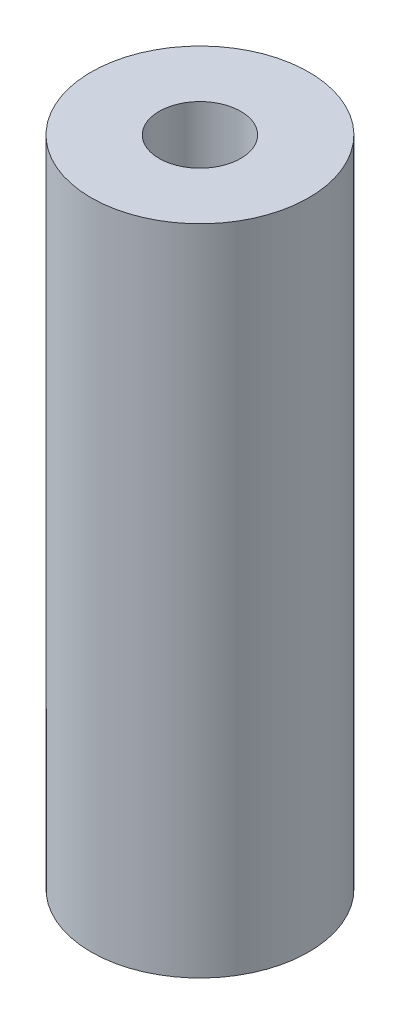
ISO-10303-21;
HEADER;
FILE_DESCRIPTION(('STEP AP214'),'2;1');
FILE_NAME('part.step','',(''),(''),'','','');
FILE_SCHEMA(('AUTOMOTIVE_DESIGN { 1 0 10303 214 1 1 1 1 }'));
ENDSEC;
DATA;
#1=APPLICATION_CONTEXT('core data for automotive mechanical design processes');
#2=APPLICATION_PROTOCOL_DEFINITION('international standard','automotive_design',2000,#1);
#3=PRODUCT_CONTEXT('',#1,'mechanical');
#4=PRODUCT('Part','Part','',(#3));
#5=PRODUCT_RELATED_PRODUCT_CATEGORY('part','',(#4));
#6=PRODUCT_DEFINITION_FORMATION('','',#4);
#7=PRODUCT_DEFINITION_CONTEXT('part definition',#1,'design');
#8=PRODUCT_DEFINITION('design','',#6,#7);
#9=PRODUCT_DEFINITION_SHAPE('','',#8);
#10=(LENGTH_UNIT() NAMED_UNIT(*) SI_UNIT(.MILLI.,.METRE.));
#11=(NAMED_UNIT(*) PLANE_ANGLE_UNIT() SI_UNIT($,.RADIAN.));
#12=(NAMED_UNIT(*) SI_UNIT($,.STERADIAN.) SOLID_ANGLE_UNIT());
#13=UNCERTAINTY_MEASURE_WITH_UNIT(LENGTH_MEASURE(1.E-05),#10,'distance_accuracy_value','');
#14=(GEOMETRIC_REPRESENTATION_CONTEXT(3) GLOBAL_UNCERTAINTY_ASSIGNED_CONTEXT((#13)) GLOBAL_UNIT_ASSIGNED_CONTEXT((#10,
#11,#12)) REPRESENTATION_CONTEXT('',''));
#15=CARTESIAN_POINT('',(0.,0.,0.));
#16=DIRECTION('',(0.,0.,1.));
#17=DIRECTION('',(1.,0.,0.));
#18=AXIS2_PLACEMENT_3D('',#15,#16,#17);
#19=CARTESIAN_POINT('',(0.,24.,0.));
#20=DIRECTION('',(0.,-1.,0.));
#21=DIRECTION('',(0.,0.,-1.));
#22=AXIS2_PLACEMENT_3D('',#19,#20,#21);
#23=CYLINDRICAL_SURFACE('',#22,4.);
#24=CARTESIAN_POINT('',(0.,24.,0.));
#25=DIRECTION('',(0.,1.,0.));
#26=DIRECTION('',(0.,0.,1.));
#27=AXIS2_PLACEMENT_3D('',#24,#25,#26);
#28=CIRCLE('',#27,4.);
#29=CARTESIAN_POINT('',(0.,24.,4.));
#30=VERTEX_POINT('',#29);
#31=EDGE_CURVE('E10',#30,#30,#28,.T.);
#32=ORIENTED_EDGE('',*,*,#31,.F.);
#33=EDGE_LOOP('',(#32));
#34=FACE_BOUND('',#33,.T.);
#35=CARTESIAN_POINT('',(0.,0.,0.));
#36=DIRECTION('',(0.,1.,0.));
#37=DIRECTION('',(0.,0.,1.));
#38=AXIS2_PLACEMENT_3D('',#35,#36,#37);
#39=CIRCLE('',#38,4.);
#40=CARTESIAN_POINT('',(0.,0.,4.));
#41=VERTEX_POINT('',#40);
#42=EDGE_CURVE('E40',#41,#41,#39,.T.);
#43=ORIENTED_EDGE('',*,*,#42,.T.);
#44=EDGE_LOOP('',(#43));
#45=FACE_BOUND('',#44,.T.);
#46=ADVANCED_FACE('F37',(#34,#45),#23,.T.);
#47=CARTESIAN_POINT('',(0.,24.,0.));
#48=DIRECTION('',(0.,1.,0.));
#49=DIRECTION('',(0.,0.,1.));
#50=AXIS2_PLACEMENT_3D('',#47,#48,#49);
#51=PLANE('',#50);
#52=CARTESIAN_POINT('',(0.,24.,0.));
#53=DIRECTION('',(0.,1.,0.));
#54=DIRECTION('',(0.,0.,1.));
#55=AXIS2_PLACEMENT_3D('',#52,#53,#54);
#56=CIRCLE('',#55,1.5);
#57=CARTESIAN_POINT('',(0.,24.,1.5));
#58=VERTEX_POINT('',#57);
#59=EDGE_CURVE('E49',#58,#58,#56,.T.);
#60=ORIENTED_EDGE('',*,*,#59,.F.);
#61=EDGE_LOOP('',(#60));
#62=FACE_BOUND('',#61,.T.);
#63=ORIENTED_EDGE('',*,*,#31,.T.);
#64=EDGE_LOOP('',(#63));
#65=FACE_BOUND('',#64,.T.);
#66=ADVANCED_FACE('F64',(#62,#65),#51,.T.);
#67=CARTESIAN_POINT('',(0.,0.,0.));
#68=DIRECTION('',(0.,1.,0.));
#69=DIRECTION('',(0.,0.,1.));
#70=AXIS2_PLACEMENT_3D('',#67,#68,#69);
#71=PLANE('',#70);
#72=CARTESIAN_POINT('',(0.,0.,0.));
#73=DIRECTION('',(0.,1.,0.));
#74=DIRECTION('',(0.,0.,1.));
#75=AXIS2_PLACEMENT_3D('',#72,#73,#74);
#76=CIRCLE('',#75,1.5);
#77=CARTESIAN_POINT('',(0.,0.,1.5));
#78=VERTEX_POINT('',#77);
#79=EDGE_CURVE('E47',#78,#78,#76,.T.);
#80=ORIENTED_EDGE('',*,*,#79,.T.);
#81=EDGE_LOOP('',(#80));
#82=FACE_BOUND('',#81,.T.);
#83=ORIENTED_EDGE('',*,*,#42,.F.);
#84=EDGE_LOOP('',(#83));
#85=FACE_BOUND('',#84,.T.);
#86=ADVANCED_FACE('F55',(#82,#85),#71,.F.);
#87=CARTESIAN_POINT('',(0.,0.,0.));
#88=DIRECTION('',(0.,1.,0.));
#89=DIRECTION('',(0.,0.,1.));
#90=AXIS2_PLACEMENT_3D('',#87,#88,#89);
#91=CYLINDRICAL_SURFACE('',#90,1.5);
#92=ORIENTED_EDGE('',*,*,#79,.F.);
#93=EDGE_LOOP('',(#92));
#94=FACE_BOUND('',#93,.T.);
#95=ORIENTED_EDGE('',*,*,#59,.T.);
#96=EDGE_LOOP('',(#95));
#97=FACE_BOUND('',#96,.T.);
#98=ADVANCED_FACE('F58',(#94,#97),#91,.F.);
#99=CLOSED_SHELL('',(#46,#66,#86,#98));
#100=MANIFOLD_SOLID_BREP('B2',#99);
#101=ADVANCED_BREP_SHAPE_REPRESENTATION('',(#18,#100),#14);
#102=SHAPE_DEFINITION_REPRESENTATION(#9,#101);
ENDSEC;
END-ISO-10303-21;
